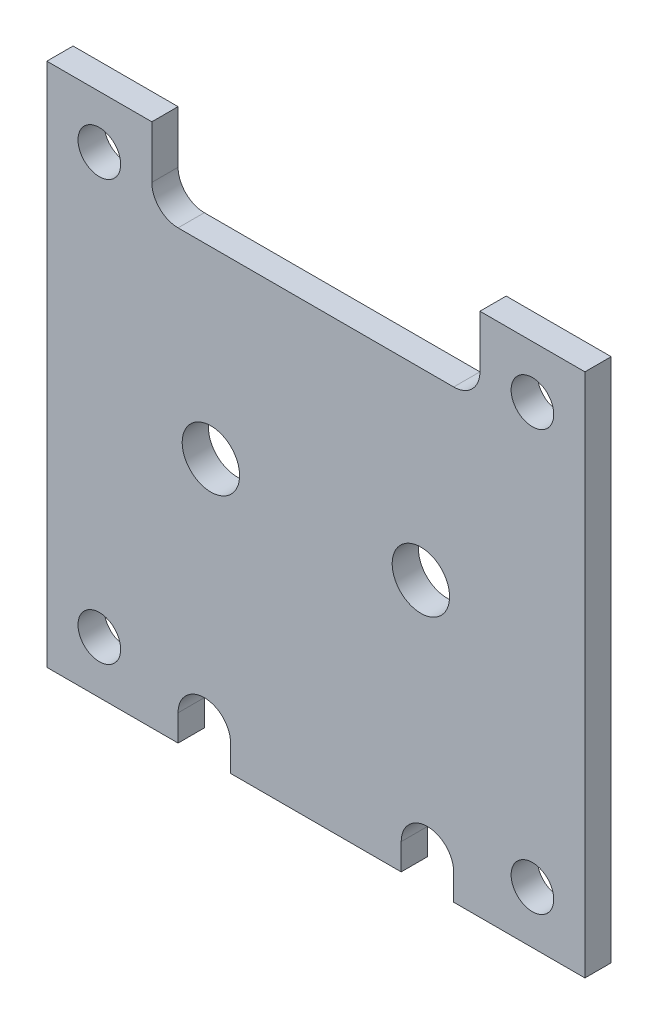
ISO-10303-21;
HEADER;
FILE_DESCRIPTION(('STEP AP214'),'2;1');
FILE_NAME('part.step','',(''),(''),'','','');
FILE_SCHEMA(('AUTOMOTIVE_DESIGN { 1 0 10303 214 1 1 1 1 }'));
ENDSEC;
DATA;
#1=APPLICATION_CONTEXT('core data for automotive mechanical design processes');
#2=APPLICATION_PROTOCOL_DEFINITION('international standard','automotive_design',2000,#1);
#3=PRODUCT_CONTEXT('',#1,'mechanical');
#4=PRODUCT('Part','Part','',(#3));
#5=PRODUCT_RELATED_PRODUCT_CATEGORY('part','',(#4));
#6=PRODUCT_DEFINITION_FORMATION('','',#4);
#7=PRODUCT_DEFINITION_CONTEXT('part definition',#1,'design');
#8=PRODUCT_DEFINITION('design','',#6,#7);
#9=PRODUCT_DEFINITION_SHAPE('','',#8);
#10=(LENGTH_UNIT() NAMED_UNIT(*) SI_UNIT(.MILLI.,.METRE.));
#11=(NAMED_UNIT(*) PLANE_ANGLE_UNIT() SI_UNIT($,.RADIAN.));
#12=(NAMED_UNIT(*) SI_UNIT($,.STERADIAN.) SOLID_ANGLE_UNIT());
#13=UNCERTAINTY_MEASURE_WITH_UNIT(LENGTH_MEASURE(1.E-05),#10,'distance_accuracy_value','');
#14=(GEOMETRIC_REPRESENTATION_CONTEXT(3) GLOBAL_UNCERTAINTY_ASSIGNED_CONTEXT((#13)) GLOBAL_UNIT_ASSIGNED_CONTEXT((#10,
#11,#12)) REPRESENTATION_CONTEXT('',''));
#15=CARTESIAN_POINT('',(0.,0.,0.));
#16=DIRECTION('',(0.,0.,1.));
#17=DIRECTION('',(1.,0.,0.));
#18=AXIS2_PLACEMENT_3D('',#15,#16,#17);
#19=CARTESIAN_POINT('',(65.0875,63.5,-6.35));
#20=DIRECTION('',(0.,0.,-1.));
#21=DIRECTION('',(-1.,0.,0.));
#22=AXIS2_PLACEMENT_3D('',#19,#20,#21);
#23=PLANE('',#22);
#24=CARTESIAN_POINT('',(25.4,0.,-6.35));
#25=DIRECTION('',(0.,0.,-1.));
#26=DIRECTION('',(-1.,0.,0.));
#27=AXIS2_PLACEMENT_3D('',#24,#25,#26);
#28=CIRCLE('',#27,6.94562999999999);
#29=CARTESIAN_POINT('',(18.45437,0.,-6.35));
#30=VERTEX_POINT('',#29);
#31=EDGE_CURVE('E376',#30,#30,#28,.T.);
#32=ORIENTED_EDGE('',*,*,#31,.F.);
#33=EDGE_LOOP('',(#32));
#34=FACE_BOUND('',#33,.T.);
#35=CARTESIAN_POINT('',(-25.4,0.,-6.35));
#36=DIRECTION('',(0.,0.,-1.));
#37=DIRECTION('',(-1.,0.,0.));
#38=AXIS2_PLACEMENT_3D('',#35,#36,#37);
#39=CIRCLE('',#38,6.94562999999999);
#40=CARTESIAN_POINT('',(-32.34563,0.,-6.35));
#41=VERTEX_POINT('',#40);
#42=EDGE_CURVE('E370',#41,#41,#39,.T.);
#43=ORIENTED_EDGE('',*,*,#42,.F.);
#44=EDGE_LOOP('',(#43));
#45=FACE_BOUND('',#44,.T.);
#46=CARTESIAN_POINT('',(-52.3875,50.8,-6.35));
#47=DIRECTION('',(0.,0.,1.));
#48=DIRECTION('',(1.,0.,0.));
#49=AXIS2_PLACEMENT_3D('',#46,#47,#48);
#50=CIRCLE('',#49,5.15873999999999);
#51=CARTESIAN_POINT('',(-47.22876,50.8,-6.35));
#52=VERTEX_POINT('',#51);
#53=EDGE_CURVE('E241',#52,#52,#50,.T.);
#54=ORIENTED_EDGE('',*,*,#53,.T.);
#55=EDGE_LOOP('',(#54));
#56=FACE_BOUND('',#55,.T.);
#57=CARTESIAN_POINT('',(52.3875,50.8,-6.35));
#58=DIRECTION('',(0.,0.,1.));
#59=DIRECTION('',(1.,0.,0.));
#60=AXIS2_PLACEMENT_3D('',#57,#58,#59);
#61=CIRCLE('',#60,5.15873999999999);
#62=CARTESIAN_POINT('',(57.54624,50.8,-6.35));
#63=VERTEX_POINT('',#62);
#64=EDGE_CURVE('E247',#63,#63,#61,.T.);
#65=ORIENTED_EDGE('',*,*,#64,.T.);
#66=EDGE_LOOP('',(#65));
#67=FACE_BOUND('',#66,.T.);
#68=CARTESIAN_POINT('',(52.3875,-50.8,-6.35));
#69=DIRECTION('',(0.,0.,1.));
#70=DIRECTION('',(1.,0.,0.));
#71=AXIS2_PLACEMENT_3D('',#68,#69,#70);
#72=CIRCLE('',#71,5.15873999999999);
#73=CARTESIAN_POINT('',(57.54624,-50.8,-6.35));
#74=VERTEX_POINT('',#73);
#75=EDGE_CURVE('E253',#74,#74,#72,.T.);
#76=ORIENTED_EDGE('',*,*,#75,.T.);
#77=EDGE_LOOP('',(#76));
#78=FACE_BOUND('',#77,.T.);
#79=CARTESIAN_POINT('',(-52.3875,-50.8,-6.35));
#80=DIRECTION('',(0.,0.,1.));
#81=DIRECTION('',(1.,0.,0.));
#82=AXIS2_PLACEMENT_3D('',#79,#80,#81);
#83=CIRCLE('',#82,5.15873999999999);
#84=CARTESIAN_POINT('',(-47.22876,-50.8,-6.35));
#85=VERTEX_POINT('',#84);
#86=EDGE_CURVE('E259',#85,#85,#83,.T.);
#87=ORIENTED_EDGE('',*,*,#86,.T.);
#88=EDGE_LOOP('',(#87));
#89=FACE_BOUND('',#88,.T.);
#90=DIRECTION('',(0.,1.,0.));
#91=VECTOR('',#90,1.);
#92=CARTESIAN_POINT('',(-20.6375,-63.5,-6.35));
#93=LINE('',#92,#91);
#94=CARTESIAN_POINT('',(-20.6375,-63.5,-6.35));
#95=VERTEX_POINT('',#94);
#96=CARTESIAN_POINT('',(-20.6375,-57.15,-6.35));
#97=VERTEX_POINT('',#96);
#98=EDGE_CURVE('E176',#95,#97,#93,.T.);
#99=ORIENTED_EDGE('',*,*,#98,.T.);
#100=CARTESIAN_POINT('',(-26.9875,-57.15,-6.35));
#101=DIRECTION('',(0.,0.,1.));
#102=DIRECTION('',(1.,0.,0.));
#103=AXIS2_PLACEMENT_3D('',#100,#101,#102);
#104=CIRCLE('',#103,6.35);
#105=CARTESIAN_POINT('',(-33.3375,-57.15,-6.35));
#106=VERTEX_POINT('',#105);
#107=EDGE_CURVE('E159',#97,#106,#104,.T.);
#108=ORIENTED_EDGE('',*,*,#107,.T.);
#109=DIRECTION('',(0.,-1.,0.));
#110=VECTOR('',#109,1.);
#111=CARTESIAN_POINT('',(-33.3375,-63.5,-6.35));
#112=LINE('',#111,#110);
#113=CARTESIAN_POINT('',(-33.3375,-63.5,-6.35));
#114=VERTEX_POINT('',#113);
#115=EDGE_CURVE('E173',#106,#114,#112,.T.);
#116=ORIENTED_EDGE('',*,*,#115,.T.);
#117=DIRECTION('',(1.,0.,0.));
#118=VECTOR('',#117,1.);
#119=CARTESIAN_POINT('',(-65.0875,-63.5,-6.35));
#120=LINE('',#119,#118);
#121=CARTESIAN_POINT('',(-65.0875,-63.5,-6.35));
#122=VERTEX_POINT('',#121);
#123=EDGE_CURVE('E275',#122,#114,#120,.T.);
#124=ORIENTED_EDGE('',*,*,#123,.F.);
#125=DIRECTION('',(0.,-1.,0.));
#126=VECTOR('',#125,1.);
#127=CARTESIAN_POINT('',(-65.0875,-63.5,-6.35));
#128=LINE('',#127,#126);
#129=CARTESIAN_POINT('',(-65.0875,63.5,-6.35));
#130=VERTEX_POINT('',#129);
#131=EDGE_CURVE('E271',#130,#122,#128,.T.);
#132=ORIENTED_EDGE('',*,*,#131,.F.);
#133=DIRECTION('',(-1.,0.,0.));
#134=VECTOR('',#133,1.);
#135=CARTESIAN_POINT('',(-65.0875,63.5,-6.35));
#136=LINE('',#135,#134);
#137=CARTESIAN_POINT('',(-39.6875,63.5,-6.35));
#138=VERTEX_POINT('',#137);
#139=EDGE_CURVE('E266',#138,#130,#136,.T.);
#140=ORIENTED_EDGE('',*,*,#139,.F.);
#141=DIRECTION('',(0.,-1.,0.));
#142=VECTOR('',#141,1.);
#143=CARTESIAN_POINT('',(-39.6875,63.5,-6.35));
#144=LINE('',#143,#142);
#145=CARTESIAN_POINT('',(-39.6875,50.8,-6.35));
#146=VERTEX_POINT('',#145);
#147=EDGE_CURVE('E220',#138,#146,#144,.T.);
#148=ORIENTED_EDGE('',*,*,#147,.T.);
#149=CARTESIAN_POINT('',(-33.3375,50.8,-6.35));
#150=DIRECTION('',(0.,0.,-1.));
#151=DIRECTION('',(-1.,0.,0.));
#152=AXIS2_PLACEMENT_3D('',#149,#150,#151);
#153=CIRCLE('',#152,6.35);
#154=CARTESIAN_POINT('',(-33.3375,44.45,-6.35));
#155=VERTEX_POINT('',#154);
#156=EDGE_CURVE('E11',#146,#155,#153,.F.);
#157=ORIENTED_EDGE('',*,*,#156,.T.);
#158=DIRECTION('',(1.,0.,0.));
#159=VECTOR('',#158,1.);
#160=CARTESIAN_POINT('',(-39.6875,44.45,-6.35));
#161=LINE('',#160,#159);
#162=CARTESIAN_POINT('',(33.3375,44.45,-6.35));
#163=VERTEX_POINT('',#162);
#164=EDGE_CURVE('E222',#155,#163,#161,.T.);
#165=ORIENTED_EDGE('',*,*,#164,.T.);
#166=CARTESIAN_POINT('',(33.3375,50.8,-6.35));
#167=DIRECTION('',(0.,0.,-1.));
#168=DIRECTION('',(-1.,0.,0.));
#169=AXIS2_PLACEMENT_3D('',#166,#167,#168);
#170=CIRCLE('',#169,6.35);
#171=CARTESIAN_POINT('',(39.6875,50.8,-6.35));
#172=VERTEX_POINT('',#171);
#173=EDGE_CURVE('E312',#163,#172,#170,.F.);
#174=ORIENTED_EDGE('',*,*,#173,.T.);
#175=DIRECTION('',(0.,1.,0.));
#176=VECTOR('',#175,1.);
#177=CARTESIAN_POINT('',(39.6875,63.5,-6.35));
#178=LINE('',#177,#176);
#179=CARTESIAN_POINT('',(39.6875,63.5,-6.35));
#180=VERTEX_POINT('',#179);
#181=EDGE_CURVE('E226',#172,#180,#178,.T.);
#182=ORIENTED_EDGE('',*,*,#181,.T.);
#183=CARTESIAN_POINT('',(65.0875,63.5,-6.35));
#184=VERTEX_POINT('',#183);
#185=EDGE_CURVE('E268',#184,#180,#136,.T.);
#186=ORIENTED_EDGE('',*,*,#185,.F.);
#187=DIRECTION('',(0.,1.,0.));
#188=VECTOR('',#187,1.);
#189=CARTESIAN_POINT('',(65.0875,-63.5,-6.35));
#190=LINE('',#189,#188);
#191=CARTESIAN_POINT('',(65.0875,-63.5,-6.35));
#192=VERTEX_POINT('',#191);
#193=EDGE_CURVE('E263',#192,#184,#190,.T.);
#194=ORIENTED_EDGE('',*,*,#193,.F.);
#195=CARTESIAN_POINT('',(33.3375,-63.5,-6.35));
#196=VERTEX_POINT('',#195);
#197=EDGE_CURVE('E274',#196,#192,#120,.T.);
#198=ORIENTED_EDGE('',*,*,#197,.F.);
#199=DIRECTION('',(0.,-1.,0.));
#200=VECTOR('',#199,1.);
#201=CARTESIAN_POINT('',(33.3375,-63.5,-6.35));
#202=LINE('',#201,#200);
#203=CARTESIAN_POINT('',(33.3375,-57.15,-6.35));
#204=VERTEX_POINT('',#203);
#205=EDGE_CURVE('E196',#204,#196,#202,.T.);
#206=ORIENTED_EDGE('',*,*,#205,.F.);
#207=CARTESIAN_POINT('',(26.9875,-57.15,-6.35));
#208=DIRECTION('',(0.,0.,-1.));
#209=DIRECTION('',(-1.,0.,0.));
#210=AXIS2_PLACEMENT_3D('',#207,#208,#209);
#211=CIRCLE('',#210,6.35);
#212=CARTESIAN_POINT('',(20.6375,-57.15,-6.35));
#213=VERTEX_POINT('',#212);
#214=EDGE_CURVE('E190',#213,#204,#211,.T.);
#215=ORIENTED_EDGE('',*,*,#214,.F.);
#216=DIRECTION('',(0.,1.,0.));
#217=VECTOR('',#216,1.);
#218=CARTESIAN_POINT('',(20.6375,-63.5,-6.35));
#219=LINE('',#218,#217);
#220=CARTESIAN_POINT('',(20.6375,-63.5,-6.35));
#221=VERTEX_POINT('',#220);
#222=EDGE_CURVE('E202',#221,#213,#219,.T.);
#223=ORIENTED_EDGE('',*,*,#222,.F.);
#224=EDGE_CURVE('E278',#95,#221,#120,.T.);
#225=ORIENTED_EDGE('',*,*,#224,.F.);
#226=EDGE_LOOP('',(#99,#108,#116,#124,#132,#140,#148,#157,#165,#174,#182,#186,#194,#198,#206,
#215,#223,#225));
#227=FACE_BOUND('',#226,.T.);
#228=ADVANCED_FACE('F32',(#34,#45,#56,#67,#78,#89,#227),#23,.T.);
#229=CARTESIAN_POINT('',(65.0875,63.5,0.));
#230=DIRECTION('',(0.,0.,-1.));
#231=DIRECTION('',(-1.,0.,0.));
#232=AXIS2_PLACEMENT_3D('',#229,#230,#231);
#233=PLANE('',#232);
#234=CARTESIAN_POINT('',(25.4,0.,0.));
#235=DIRECTION('',(0.,0.,-1.));
#236=DIRECTION('',(-1.,0.,0.));
#237=AXIS2_PLACEMENT_3D('',#234,#235,#236);
#238=CIRCLE('',#237,6.94563);
#239=CARTESIAN_POINT('',(18.45437,0.,0.));
#240=VERTEX_POINT('',#239);
#241=EDGE_CURVE('E373',#240,#240,#238,.T.);
#242=ORIENTED_EDGE('',*,*,#241,.T.);
#243=EDGE_LOOP('',(#242));
#244=FACE_BOUND('',#243,.T.);
#245=CARTESIAN_POINT('',(-25.4,0.,0.));
#246=DIRECTION('',(0.,0.,-1.));
#247=DIRECTION('',(-1.,0.,0.));
#248=AXIS2_PLACEMENT_3D('',#245,#246,#247);
#249=CIRCLE('',#248,6.94563);
#250=CARTESIAN_POINT('',(-32.34563,0.,0.));
#251=VERTEX_POINT('',#250);
#252=EDGE_CURVE('E177',#251,#251,#249,.T.);
#253=ORIENTED_EDGE('',*,*,#252,.T.);
#254=EDGE_LOOP('',(#253));
#255=FACE_BOUND('',#254,.T.);
#256=CARTESIAN_POINT('',(-52.3875,50.8,0.));
#257=DIRECTION('',(0.,0.,1.));
#258=DIRECTION('',(1.,0.,0.));
#259=AXIS2_PLACEMENT_3D('',#256,#257,#258);
#260=CIRCLE('',#259,5.15874);
#261=CARTESIAN_POINT('',(-47.22876,50.8,0.));
#262=VERTEX_POINT('',#261);
#263=EDGE_CURVE('E236',#262,#262,#260,.T.);
#264=ORIENTED_EDGE('',*,*,#263,.F.);
#265=EDGE_LOOP('',(#264));
#266=FACE_BOUND('',#265,.T.);
#267=CARTESIAN_POINT('',(52.3875,50.8,0.));
#268=DIRECTION('',(0.,0.,1.));
#269=DIRECTION('',(1.,0.,0.));
#270=AXIS2_PLACEMENT_3D('',#267,#268,#269);
#271=CIRCLE('',#270,5.15874);
#272=CARTESIAN_POINT('',(57.54624,50.8,0.));
#273=VERTEX_POINT('',#272);
#274=EDGE_CURVE('E244',#273,#273,#271,.T.);
#275=ORIENTED_EDGE('',*,*,#274,.F.);
#276=EDGE_LOOP('',(#275));
#277=FACE_BOUND('',#276,.T.);
#278=CARTESIAN_POINT('',(52.3875,-50.8,0.));
#279=DIRECTION('',(0.,0.,1.));
#280=DIRECTION('',(1.,0.,0.));
#281=AXIS2_PLACEMENT_3D('',#278,#279,#280);
#282=CIRCLE('',#281,5.15874);
#283=CARTESIAN_POINT('',(57.54624,-50.8,0.));
#284=VERTEX_POINT('',#283);
#285=EDGE_CURVE('E250',#284,#284,#282,.T.);
#286=ORIENTED_EDGE('',*,*,#285,.F.);
#287=EDGE_LOOP('',(#286));
#288=FACE_BOUND('',#287,.T.);
#289=CARTESIAN_POINT('',(-52.3875,-50.8,0.));
#290=DIRECTION('',(0.,0.,1.));
#291=DIRECTION('',(1.,0.,0.));
#292=AXIS2_PLACEMENT_3D('',#289,#290,#291);
#293=CIRCLE('',#292,5.15874);
#294=CARTESIAN_POINT('',(-47.22876,-50.8,0.));
#295=VERTEX_POINT('',#294);
#296=EDGE_CURVE('E256',#295,#295,#293,.T.);
#297=ORIENTED_EDGE('',*,*,#296,.F.);
#298=EDGE_LOOP('',(#297));
#299=FACE_BOUND('',#298,.T.);
#300=CARTESIAN_POINT('',(-26.9875,-57.15,0.));
#301=DIRECTION('',(0.,0.,1.));
#302=DIRECTION('',(1.,0.,0.));
#303=AXIS2_PLACEMENT_3D('',#300,#301,#302);
#304=CIRCLE('',#303,6.35);
#305=CARTESIAN_POINT('',(-20.6375,-57.15,0.));
#306=VERTEX_POINT('',#305);
#307=CARTESIAN_POINT('',(-33.3375,-57.15,0.));
#308=VERTEX_POINT('',#307);
#309=EDGE_CURVE('E162',#306,#308,#304,.T.);
#310=ORIENTED_EDGE('',*,*,#309,.F.);
#311=DIRECTION('',(0.,1.,0.));
#312=VECTOR('',#311,1.);
#313=CARTESIAN_POINT('',(-20.6375,-63.5,0.));
#314=LINE('',#313,#312);
#315=CARTESIAN_POINT('',(-20.6375,-63.5,0.));
#316=VERTEX_POINT('',#315);
#317=EDGE_CURVE('E167',#316,#306,#314,.T.);
#318=ORIENTED_EDGE('',*,*,#317,.F.);
#319=DIRECTION('',(1.,0.,0.));
#320=VECTOR('',#319,1.);
#321=CARTESIAN_POINT('',(-65.0875,-63.5,0.));
#322=LINE('',#321,#320);
#323=CARTESIAN_POINT('',(20.6375,-63.5,0.));
#324=VERTEX_POINT('',#323);
#325=EDGE_CURVE('E291',#316,#324,#322,.T.);
#326=ORIENTED_EDGE('',*,*,#325,.T.);
#327=DIRECTION('',(0.,1.,0.));
#328=VECTOR('',#327,1.);
#329=CARTESIAN_POINT('',(20.6375,-63.5,0.));
#330=LINE('',#329,#328);
#331=CARTESIAN_POINT('',(20.6375,-57.15,0.));
#332=VERTEX_POINT('',#331);
#333=EDGE_CURVE('E201',#324,#332,#330,.T.);
#334=ORIENTED_EDGE('',*,*,#333,.T.);
#335=CARTESIAN_POINT('',(26.9875,-57.15,0.));
#336=DIRECTION('',(0.,0.,-1.));
#337=DIRECTION('',(-1.,0.,0.));
#338=AXIS2_PLACEMENT_3D('',#335,#336,#337);
#339=CIRCLE('',#338,6.35);
#340=CARTESIAN_POINT('',(33.3375,-57.15,0.));
#341=VERTEX_POINT('',#340);
#342=EDGE_CURVE('E47',#332,#341,#339,.T.);
#343=ORIENTED_EDGE('',*,*,#342,.T.);
#344=DIRECTION('',(0.,-1.,0.));
#345=VECTOR('',#344,1.);
#346=CARTESIAN_POINT('',(33.3375,-63.5,0.));
#347=LINE('',#346,#345);
#348=CARTESIAN_POINT('',(33.3375,-63.5,0.));
#349=VERTEX_POINT('',#348);
#350=EDGE_CURVE('E198',#341,#349,#347,.T.);
#351=ORIENTED_EDGE('',*,*,#350,.T.);
#352=CARTESIAN_POINT('',(65.0875,-63.5,0.));
#353=VERTEX_POINT('',#352);
#354=EDGE_CURVE('E288',#349,#353,#322,.T.);
#355=ORIENTED_EDGE('',*,*,#354,.T.);
#356=DIRECTION('',(0.,1.,0.));
#357=VECTOR('',#356,1.);
#358=CARTESIAN_POINT('',(65.0875,-63.5,0.));
#359=LINE('',#358,#357);
#360=CARTESIAN_POINT('',(65.0875,63.5,0.));
#361=VERTEX_POINT('',#360);
#362=EDGE_CURVE('E262',#353,#361,#359,.T.);
#363=ORIENTED_EDGE('',*,*,#362,.T.);
#364=DIRECTION('',(-1.,0.,0.));
#365=VECTOR('',#364,1.);
#366=CARTESIAN_POINT('',(-65.0875,63.5,0.));
#367=LINE('',#366,#365);
#368=CARTESIAN_POINT('',(39.6875,63.5,0.));
#369=VERTEX_POINT('',#368);
#370=EDGE_CURVE('E282',#361,#369,#367,.T.);
#371=ORIENTED_EDGE('',*,*,#370,.T.);
#372=DIRECTION('',(0.,1.,0.));
#373=VECTOR('',#372,1.);
#374=CARTESIAN_POINT('',(39.6875,63.5,0.));
#375=LINE('',#374,#373);
#376=CARTESIAN_POINT('',(39.6875,50.8,0.));
#377=VERTEX_POINT('',#376);
#378=EDGE_CURVE('E223',#377,#369,#375,.T.);
#379=ORIENTED_EDGE('',*,*,#378,.F.);
#380=CARTESIAN_POINT('',(33.3375,50.8,0.));
#381=DIRECTION('',(0.,0.,-1.));
#382=DIRECTION('',(-1.,0.,0.));
#383=AXIS2_PLACEMENT_3D('',#380,#381,#382);
#384=CIRCLE('',#383,6.35);
#385=CARTESIAN_POINT('',(33.3375,44.45,0.));
#386=VERTEX_POINT('',#385);
#387=EDGE_CURVE('E310',#377,#386,#384,.T.);
#388=ORIENTED_EDGE('',*,*,#387,.T.);
#389=DIRECTION('',(1.,0.,0.));
#390=VECTOR('',#389,1.);
#391=CARTESIAN_POINT('',(-39.6875,44.45,0.));
#392=LINE('',#391,#390);
#393=CARTESIAN_POINT('',(-33.3375,44.45,0.));
#394=VERTEX_POINT('',#393);
#395=EDGE_CURVE('E230',#394,#386,#392,.T.);
#396=ORIENTED_EDGE('',*,*,#395,.F.);
#397=CARTESIAN_POINT('',(-33.3375,50.8,0.));
#398=DIRECTION('',(0.,0.,-1.));
#399=DIRECTION('',(-1.,0.,0.));
#400=AXIS2_PLACEMENT_3D('',#397,#398,#399);
#401=CIRCLE('',#400,6.35);
#402=CARTESIAN_POINT('',(-39.6875,50.8,0.));
#403=VERTEX_POINT('',#402);
#404=EDGE_CURVE('E40',#394,#403,#401,.T.);
#405=ORIENTED_EDGE('',*,*,#404,.T.);
#406=DIRECTION('',(0.,-1.,0.));
#407=VECTOR('',#406,1.);
#408=CARTESIAN_POINT('',(-39.6875,63.5,0.));
#409=LINE('',#408,#407);
#410=CARTESIAN_POINT('',(-39.6875,63.5,0.));
#411=VERTEX_POINT('',#410);
#412=EDGE_CURVE('E212',#411,#403,#409,.T.);
#413=ORIENTED_EDGE('',*,*,#412,.F.);
#414=CARTESIAN_POINT('',(-65.0875,63.5,0.));
#415=VERTEX_POINT('',#414);
#416=EDGE_CURVE('E281',#411,#415,#367,.T.);
#417=ORIENTED_EDGE('',*,*,#416,.T.);
#418=DIRECTION('',(0.,-1.,0.));
#419=VECTOR('',#418,1.);
#420=CARTESIAN_POINT('',(-65.0875,-63.5,0.));
#421=LINE('',#420,#419);
#422=CARTESIAN_POINT('',(-65.0875,-63.5,0.));
#423=VERTEX_POINT('',#422);
#424=EDGE_CURVE('E285',#415,#423,#421,.T.);
#425=ORIENTED_EDGE('',*,*,#424,.T.);
#426=CARTESIAN_POINT('',(-33.3375,-63.5,0.));
#427=VERTEX_POINT('',#426);
#428=EDGE_CURVE('E267',#423,#427,#322,.T.);
#429=ORIENTED_EDGE('',*,*,#428,.T.);
#430=DIRECTION('',(0.,-1.,0.));
#431=VECTOR('',#430,1.);
#432=CARTESIAN_POINT('',(-33.3375,-63.5,0.));
#433=LINE('',#432,#431);
#434=EDGE_CURVE('E183',#308,#427,#433,.T.);
#435=ORIENTED_EDGE('',*,*,#434,.F.);
#436=EDGE_LOOP('',(#310,#318,#326,#334,#343,#351,#355,#363,#371,#379,#388,#396,#405,#413,#417,
#425,#429,#435));
#437=FACE_BOUND('',#436,.T.);
#438=ADVANCED_FACE('F316',(#244,#255,#266,#277,#288,#299,#437),#233,.F.);
#439=CARTESIAN_POINT('',(-65.0875,-63.5,-6.35));
#440=DIRECTION('',(0.,-1.,0.));
#441=DIRECTION('',(0.,0.,-1.));
#442=AXIS2_PLACEMENT_3D('',#439,#440,#441);
#443=PLANE('',#442);
#444=ORIENTED_EDGE('',*,*,#123,.T.);
#445=DIRECTION('',(0.,0.,-1.));
#446=VECTOR('',#445,1.);
#447=CARTESIAN_POINT('',(-33.3375,-63.5,0.));
#448=LINE('',#447,#446);
#449=EDGE_CURVE('E181',#427,#114,#448,.T.);
#450=ORIENTED_EDGE('',*,*,#449,.F.);
#451=ORIENTED_EDGE('',*,*,#428,.F.);
#452=DIRECTION('',(0.,0.,1.));
#453=VECTOR('',#452,1.);
#454=CARTESIAN_POINT('',(-65.0875,-63.5,-6.35));
#455=LINE('',#454,#453);
#456=EDGE_CURVE('E296',#122,#423,#455,.T.);
#457=ORIENTED_EDGE('',*,*,#456,.F.);
#458=EDGE_LOOP('',(#444,#450,#451,#457));
#459=FACE_BOUND('',#458,.T.);
#460=ADVANCED_FACE('F403',(#459),#443,.T.);
#461=ORIENTED_EDGE('',*,*,#325,.F.);
#462=DIRECTION('',(0.,0.,-1.));
#463=VECTOR('',#462,1.);
#464=CARTESIAN_POINT('',(-20.6375,-63.5,0.));
#465=LINE('',#464,#463);
#466=EDGE_CURVE('E191',#316,#95,#465,.T.);
#467=ORIENTED_EDGE('',*,*,#466,.T.);
#468=ORIENTED_EDGE('',*,*,#224,.T.);
#469=DIRECTION('',(0.,0.,-1.));
#470=VECTOR('',#469,1.);
#471=CARTESIAN_POINT('',(20.6375,-63.5,0.));
#472=LINE('',#471,#470);
#473=EDGE_CURVE('E215',#324,#221,#472,.T.);
#474=ORIENTED_EDGE('',*,*,#473,.F.);
#475=EDGE_LOOP('',(#461,#467,#468,#474));
#476=FACE_BOUND('',#475,.T.);
#477=ADVANCED_FACE('F354',(#476),#443,.T.);
#478=DIRECTION('',(0.,0.,-1.));
#479=VECTOR('',#478,1.);
#480=CARTESIAN_POINT('',(33.3375,-63.5,0.));
#481=LINE('',#480,#479);
#482=EDGE_CURVE('E205',#349,#196,#481,.T.);
#483=ORIENTED_EDGE('',*,*,#482,.T.);
#484=ORIENTED_EDGE('',*,*,#197,.T.);
#485=DIRECTION('',(0.,0.,1.));
#486=VECTOR('',#485,1.);
#487=CARTESIAN_POINT('',(65.0875,-63.5,-6.35));
#488=LINE('',#487,#486);
#489=EDGE_CURVE('E292',#192,#353,#488,.T.);
#490=ORIENTED_EDGE('',*,*,#489,.T.);
#491=ORIENTED_EDGE('',*,*,#354,.F.);
#492=EDGE_LOOP('',(#483,#484,#490,#491));
#493=FACE_BOUND('',#492,.T.);
#494=ADVANCED_FACE('F349',(#493),#443,.T.);
#495=CARTESIAN_POINT('',(-65.0875,63.5,-6.35));
#496=DIRECTION('',(0.,1.,0.));
#497=DIRECTION('',(0.,0.,1.));
#498=AXIS2_PLACEMENT_3D('',#495,#496,#497);
#499=PLANE('',#498);
#500=DIRECTION('',(0.,0.,1.));
#501=VECTOR('',#500,1.);
#502=CARTESIAN_POINT('',(-39.6875,63.5,-6.35));
#503=LINE('',#502,#501);
#504=EDGE_CURVE('E234',#138,#411,#503,.T.);
#505=ORIENTED_EDGE('',*,*,#504,.F.);
#506=ORIENTED_EDGE('',*,*,#139,.T.);
#507=DIRECTION('',(0.,0.,1.));
#508=VECTOR('',#507,1.);
#509=CARTESIAN_POINT('',(-65.0875,63.5,-6.35));
#510=LINE('',#509,#508);
#511=EDGE_CURVE('E298',#130,#415,#510,.T.);
#512=ORIENTED_EDGE('',*,*,#511,.T.);
#513=ORIENTED_EDGE('',*,*,#416,.F.);
#514=EDGE_LOOP('',(#505,#506,#512,#513));
#515=FACE_BOUND('',#514,.T.);
#516=ADVANCED_FACE('F419',(#515),#499,.T.);
#517=CARTESIAN_POINT('',(65.0875,-63.5,-6.35));
#518=DIRECTION('',(1.,0.,0.));
#519=DIRECTION('',(0.,0.,-1.));
#520=AXIS2_PLACEMENT_3D('',#517,#518,#519);
#521=PLANE('',#520);
#522=ORIENTED_EDGE('',*,*,#362,.F.);
#523=ORIENTED_EDGE('',*,*,#489,.F.);
#524=ORIENTED_EDGE('',*,*,#193,.T.);
#525=DIRECTION('',(0.,0.,1.));
#526=VECTOR('',#525,1.);
#527=CARTESIAN_POINT('',(65.0875,63.5,-6.35));
#528=LINE('',#527,#526);
#529=EDGE_CURVE('E277',#184,#361,#528,.T.);
#530=ORIENTED_EDGE('',*,*,#529,.T.);
#531=EDGE_LOOP('',(#522,#523,#524,#530));
#532=FACE_BOUND('',#531,.T.);
#533=ADVANCED_FACE('F346',(#532),#521,.T.);
#534=CARTESIAN_POINT('',(-65.0875,-63.5,-6.35));
#535=DIRECTION('',(-1.,0.,0.));
#536=DIRECTION('',(0.,0.,1.));
#537=AXIS2_PLACEMENT_3D('',#534,#535,#536);
#538=PLANE('',#537);
#539=ORIENTED_EDGE('',*,*,#424,.F.);
#540=ORIENTED_EDGE('',*,*,#511,.F.);
#541=ORIENTED_EDGE('',*,*,#131,.T.);
#542=ORIENTED_EDGE('',*,*,#456,.T.);
#543=EDGE_LOOP('',(#539,#540,#541,#542));
#544=FACE_BOUND('',#543,.T.);
#545=ADVANCED_FACE('F413',(#544),#538,.T.);
#546=DIRECTION('',(0.,0.,1.));
#547=VECTOR('',#546,1.);
#548=CARTESIAN_POINT('',(39.6875,63.5,-6.35));
#549=LINE('',#548,#547);
#550=EDGE_CURVE('E228',#180,#369,#549,.T.);
#551=ORIENTED_EDGE('',*,*,#550,.T.);
#552=ORIENTED_EDGE('',*,*,#370,.F.);
#553=ORIENTED_EDGE('',*,*,#529,.F.);
#554=ORIENTED_EDGE('',*,*,#185,.T.);
#555=EDGE_LOOP('',(#551,#552,#553,#554));
#556=FACE_BOUND('',#555,.T.);
#557=ADVANCED_FACE('F340',(#556),#499,.T.);
#558=CARTESIAN_POINT('',(-52.3875,-50.8,0.));
#559=DIRECTION('',(0.,0.,1.));
#560=DIRECTION('',(1.,0.,0.));
#561=AXIS2_PLACEMENT_3D('',#558,#559,#560);
#562=CYLINDRICAL_SURFACE('',#561,5.15874);
#563=ORIENTED_EDGE('',*,*,#86,.F.);
#564=EDGE_LOOP('',(#563));
#565=FACE_BOUND('',#564,.T.);
#566=ORIENTED_EDGE('',*,*,#296,.T.);
#567=EDGE_LOOP('',(#566));
#568=FACE_BOUND('',#567,.T.);
#569=ADVANCED_FACE('F395',(#565,#568),#562,.F.);
#570=CARTESIAN_POINT('',(52.3875,-50.8,0.));
#571=DIRECTION('',(0.,0.,1.));
#572=DIRECTION('',(1.,0.,0.));
#573=AXIS2_PLACEMENT_3D('',#570,#571,#572);
#574=CYLINDRICAL_SURFACE('',#573,5.15874);
#575=ORIENTED_EDGE('',*,*,#75,.F.);
#576=EDGE_LOOP('',(#575));
#577=FACE_BOUND('',#576,.T.);
#578=ORIENTED_EDGE('',*,*,#285,.T.);
#579=EDGE_LOOP('',(#578));
#580=FACE_BOUND('',#579,.T.);
#581=ADVANCED_FACE('F398',(#577,#580),#574,.F.);
#582=CARTESIAN_POINT('',(52.3875,50.8,0.));
#583=DIRECTION('',(0.,0.,1.));
#584=DIRECTION('',(1.,0.,0.));
#585=AXIS2_PLACEMENT_3D('',#582,#583,#584);
#586=CYLINDRICAL_SURFACE('',#585,5.15874);
#587=ORIENTED_EDGE('',*,*,#64,.F.);
#588=EDGE_LOOP('',(#587));
#589=FACE_BOUND('',#588,.T.);
#590=ORIENTED_EDGE('',*,*,#274,.T.);
#591=EDGE_LOOP('',(#590));
#592=FACE_BOUND('',#591,.T.);
#593=ADVANCED_FACE('F438',(#589,#592),#586,.F.);
#594=CARTESIAN_POINT('',(-52.3875,50.8,0.));
#595=DIRECTION('',(0.,0.,1.));
#596=DIRECTION('',(1.,0.,0.));
#597=AXIS2_PLACEMENT_3D('',#594,#595,#596);
#598=CYLINDRICAL_SURFACE('',#597,5.15874);
#599=ORIENTED_EDGE('',*,*,#53,.F.);
#600=EDGE_LOOP('',(#599));
#601=FACE_BOUND('',#600,.T.);
#602=ORIENTED_EDGE('',*,*,#263,.T.);
#603=EDGE_LOOP('',(#602));
#604=FACE_BOUND('',#603,.T.);
#605=ADVANCED_FACE('F435',(#601,#604),#598,.F.);
#606=CARTESIAN_POINT('',(-39.6875,63.5,-6.35));
#607=DIRECTION('',(-1.,0.,0.));
#608=DIRECTION('',(0.,-1.,0.));
#609=AXIS2_PLACEMENT_3D('',#606,#607,#608);
#610=PLANE('',#609);
#611=ORIENTED_EDGE('',*,*,#412,.T.);
#612=DIRECTION('',(0.,0.,1.));
#613=VECTOR('',#612,1.);
#614=CARTESIAN_POINT('',(-39.6875,50.8,-6.35));
#615=LINE('',#614,#613);
#616=EDGE_CURVE('E55',#403,#146,#615,.F.);
#617=ORIENTED_EDGE('',*,*,#616,.T.);
#618=ORIENTED_EDGE('',*,*,#147,.F.);
#619=ORIENTED_EDGE('',*,*,#504,.T.);
#620=EDGE_LOOP('',(#611,#617,#618,#619));
#621=FACE_BOUND('',#620,.T.);
#622=ADVANCED_FACE('F320',(#621),#610,.F.);
#623=CARTESIAN_POINT('',(39.6875,63.5,-6.35));
#624=DIRECTION('',(1.,0.,0.));
#625=DIRECTION('',(0.,1.,0.));
#626=AXIS2_PLACEMENT_3D('',#623,#624,#625);
#627=PLANE('',#626);
#628=ORIENTED_EDGE('',*,*,#181,.F.);
#629=DIRECTION('',(0.,0.,1.));
#630=VECTOR('',#629,1.);
#631=CARTESIAN_POINT('',(39.6875,50.8,0.));
#632=LINE('',#631,#630);
#633=EDGE_CURVE('E295',#172,#377,#632,.T.);
#634=ORIENTED_EDGE('',*,*,#633,.T.);
#635=ORIENTED_EDGE('',*,*,#378,.T.);
#636=ORIENTED_EDGE('',*,*,#550,.F.);
#637=EDGE_LOOP('',(#628,#634,#635,#636));
#638=FACE_BOUND('',#637,.T.);
#639=ADVANCED_FACE('F336',(#638),#627,.F.);
#640=CARTESIAN_POINT('',(-39.6875,44.45,-6.35));
#641=DIRECTION('',(0.,-1.,0.));
#642=DIRECTION('',(0.,0.,-1.));
#643=AXIS2_PLACEMENT_3D('',#640,#641,#642);
#644=PLANE('',#643);
#645=ORIENTED_EDGE('',*,*,#395,.T.);
#646=DIRECTION('',(0.,0.,1.));
#647=VECTOR('',#646,1.);
#648=CARTESIAN_POINT('',(33.3375,44.45,-6.35));
#649=LINE('',#648,#647);
#650=EDGE_CURVE('E307',#386,#163,#649,.F.);
#651=ORIENTED_EDGE('',*,*,#650,.T.);
#652=ORIENTED_EDGE('',*,*,#164,.F.);
#653=DIRECTION('',(0.,0.,1.));
#654=VECTOR('',#653,1.);
#655=CARTESIAN_POINT('',(-33.3375,44.45,0.));
#656=LINE('',#655,#654);
#657=EDGE_CURVE('E304',#155,#394,#656,.T.);
#658=ORIENTED_EDGE('',*,*,#657,.T.);
#659=EDGE_LOOP('',(#645,#651,#652,#658));
#660=FACE_BOUND('',#659,.T.);
#661=ADVANCED_FACE('F327',(#660),#644,.F.);
#662=CARTESIAN_POINT('',(33.3375,50.8,-6.35));
#663=DIRECTION('',(0.,0.,-1.));
#664=DIRECTION('',(-1.,0.,0.));
#665=AXIS2_PLACEMENT_3D('',#662,#663,#664);
#666=CYLINDRICAL_SURFACE('',#665,6.35);
#667=ORIENTED_EDGE('',*,*,#173,.F.);
#668=ORIENTED_EDGE('',*,*,#650,.F.);
#669=ORIENTED_EDGE('',*,*,#387,.F.);
#670=ORIENTED_EDGE('',*,*,#633,.F.);
#671=EDGE_LOOP('',(#667,#668,#669,#670));
#672=FACE_BOUND('',#671,.T.);
#673=ADVANCED_FACE('F330',(#672),#666,.F.);
#674=CARTESIAN_POINT('',(-33.3375,50.8,-6.35));
#675=DIRECTION('',(0.,0.,-1.));
#676=DIRECTION('',(-1.,0.,0.));
#677=AXIS2_PLACEMENT_3D('',#674,#675,#676);
#678=CYLINDRICAL_SURFACE('',#677,6.35);
#679=ORIENTED_EDGE('',*,*,#156,.F.);
#680=ORIENTED_EDGE('',*,*,#616,.F.);
#681=ORIENTED_EDGE('',*,*,#404,.F.);
#682=ORIENTED_EDGE('',*,*,#657,.F.);
#683=EDGE_LOOP('',(#679,#680,#681,#682));
#684=FACE_BOUND('',#683,.T.);
#685=ADVANCED_FACE('F34',(#684),#678,.F.);
#686=CARTESIAN_POINT('',(33.3375,-63.5,0.));
#687=DIRECTION('',(1.,0.,0.));
#688=DIRECTION('',(0.,1.,0.));
#689=AXIS2_PLACEMENT_3D('',#686,#687,#688);
#690=PLANE('',#689);
#691=ORIENTED_EDGE('',*,*,#205,.T.);
#692=ORIENTED_EDGE('',*,*,#482,.F.);
#693=ORIENTED_EDGE('',*,*,#350,.F.);
#694=DIRECTION('',(0.,0.,-1.));
#695=VECTOR('',#694,1.);
#696=CARTESIAN_POINT('',(33.3375,-57.15,0.));
#697=LINE('',#696,#695);
#698=EDGE_CURVE('E209',#341,#204,#697,.T.);
#699=ORIENTED_EDGE('',*,*,#698,.T.);
#700=EDGE_LOOP('',(#691,#692,#693,#699));
#701=FACE_BOUND('',#700,.T.);
#702=ADVANCED_FACE('F363',(#701),#690,.F.);
#703=CARTESIAN_POINT('',(20.6375,-63.5,0.));
#704=DIRECTION('',(-1.,0.,0.));
#705=DIRECTION('',(0.,-1.,0.));
#706=AXIS2_PLACEMENT_3D('',#703,#704,#705);
#707=PLANE('',#706);
#708=ORIENTED_EDGE('',*,*,#222,.T.);
#709=DIRECTION('',(0.,0.,-1.));
#710=VECTOR('',#709,1.);
#711=CARTESIAN_POINT('',(20.6375,-57.15,0.));
#712=LINE('',#711,#710);
#713=EDGE_CURVE('E213',#332,#213,#712,.T.);
#714=ORIENTED_EDGE('',*,*,#713,.F.);
#715=ORIENTED_EDGE('',*,*,#333,.F.);
#716=ORIENTED_EDGE('',*,*,#473,.T.);
#717=EDGE_LOOP('',(#708,#714,#715,#716));
#718=FACE_BOUND('',#717,.T.);
#719=ADVANCED_FACE('F358',(#718),#707,.F.);
#720=CARTESIAN_POINT('',(26.9875,-57.15,0.));
#721=DIRECTION('',(0.,0.,-1.));
#722=DIRECTION('',(-1.,0.,0.));
#723=AXIS2_PLACEMENT_3D('',#720,#721,#722);
#724=CYLINDRICAL_SURFACE('',#723,6.35);
#725=ORIENTED_EDGE('',*,*,#342,.F.);
#726=ORIENTED_EDGE('',*,*,#713,.T.);
#727=ORIENTED_EDGE('',*,*,#214,.T.);
#728=ORIENTED_EDGE('',*,*,#698,.F.);
#729=EDGE_LOOP('',(#725,#726,#727,#728));
#730=FACE_BOUND('',#729,.T.);
#731=ADVANCED_FACE('F360',(#730),#724,.F.);
#732=CARTESIAN_POINT('',(-33.3375,-63.5,0.));
#733=DIRECTION('',(1.,0.,0.));
#734=DIRECTION('',(0.,1.,0.));
#735=AXIS2_PLACEMENT_3D('',#732,#733,#734);
#736=PLANE('',#735);
#737=ORIENTED_EDGE('',*,*,#115,.F.);
#738=DIRECTION('',(0.,0.,-1.));
#739=VECTOR('',#738,1.);
#740=CARTESIAN_POINT('',(-33.3375,-57.15,0.));
#741=LINE('',#740,#739);
#742=EDGE_CURVE('E156',#308,#106,#741,.T.);
#743=ORIENTED_EDGE('',*,*,#742,.F.);
#744=ORIENTED_EDGE('',*,*,#434,.T.);
#745=ORIENTED_EDGE('',*,*,#449,.T.);
#746=EDGE_LOOP('',(#737,#743,#744,#745));
#747=FACE_BOUND('',#746,.T.);
#748=ADVANCED_FACE('F179',(#747),#736,.T.);
#749=CARTESIAN_POINT('',(-20.6375,-63.5,0.));
#750=DIRECTION('',(-1.,0.,0.));
#751=DIRECTION('',(0.,-1.,0.));
#752=AXIS2_PLACEMENT_3D('',#749,#750,#751);
#753=PLANE('',#752);
#754=ORIENTED_EDGE('',*,*,#98,.F.);
#755=ORIENTED_EDGE('',*,*,#466,.F.);
#756=ORIENTED_EDGE('',*,*,#317,.T.);
#757=DIRECTION('',(0.,0.,-1.));
#758=VECTOR('',#757,1.);
#759=CARTESIAN_POINT('',(-20.6375,-57.15,0.));
#760=LINE('',#759,#758);
#761=EDGE_CURVE('E166',#306,#97,#760,.T.);
#762=ORIENTED_EDGE('',*,*,#761,.T.);
#763=EDGE_LOOP('',(#754,#755,#756,#762));
#764=FACE_BOUND('',#763,.T.);
#765=ADVANCED_FACE('F537',(#764),#753,.T.);
#766=CARTESIAN_POINT('',(-26.9875,-57.15,0.));
#767=DIRECTION('',(0.,0.,-1.));
#768=DIRECTION('',(-1.,0.,0.));
#769=AXIS2_PLACEMENT_3D('',#766,#767,#768);
#770=CYLINDRICAL_SURFACE('',#769,6.35);
#771=ORIENTED_EDGE('',*,*,#107,.F.);
#772=ORIENTED_EDGE('',*,*,#761,.F.);
#773=ORIENTED_EDGE('',*,*,#309,.T.);
#774=ORIENTED_EDGE('',*,*,#742,.T.);
#775=EDGE_LOOP('',(#771,#772,#773,#774));
#776=FACE_BOUND('',#775,.T.);
#777=ADVANCED_FACE('F158',(#776),#770,.F.);
#778=CARTESIAN_POINT('',(-25.4,0.,-6.35));
#779=DIRECTION('',(0.,0.,-1.));
#780=DIRECTION('',(-1.,0.,0.));
#781=AXIS2_PLACEMENT_3D('',#778,#779,#780);
#782=CYLINDRICAL_SURFACE('',#781,6.94562999999999);
#783=ORIENTED_EDGE('',*,*,#252,.F.);
#784=EDGE_LOOP('',(#783));
#785=FACE_BOUND('',#784,.T.);
#786=ORIENTED_EDGE('',*,*,#42,.T.);
#787=EDGE_LOOP('',(#786));
#788=FACE_BOUND('',#787,.T.);
#789=ADVANCED_FACE('F555',(#785,#788),#782,.F.);
#790=CARTESIAN_POINT('',(25.4,0.,-6.35));
#791=DIRECTION('',(0.,0.,-1.));
#792=DIRECTION('',(-1.,0.,0.));
#793=AXIS2_PLACEMENT_3D('',#790,#791,#792);
#794=CYLINDRICAL_SURFACE('',#793,6.94562999999999);
#795=ORIENTED_EDGE('',*,*,#241,.F.);
#796=EDGE_LOOP('',(#795));
#797=FACE_BOUND('',#796,.T.);
#798=ORIENTED_EDGE('',*,*,#31,.T.);
#799=EDGE_LOOP('',(#798));
#800=FACE_BOUND('',#799,.T.);
#801=ADVANCED_FACE('F380',(#797,#800),#794,.F.);
#802=CLOSED_SHELL('',(#228,#438,#460,#477,#494,#516,#533,#545,#557,#569,#581,#593,#605,#622,
#639,#661,#673,#685,#702,#719,#731,#748,#765,#777,#789,#801));
#803=MANIFOLD_SOLID_BREP('B2',#802);
#804=ADVANCED_BREP_SHAPE_REPRESENTATION('',(#18,#803),#14);
#805=SHAPE_DEFINITION_REPRESENTATION(#9,#804);
ENDSEC;
END-ISO-10303-21;
